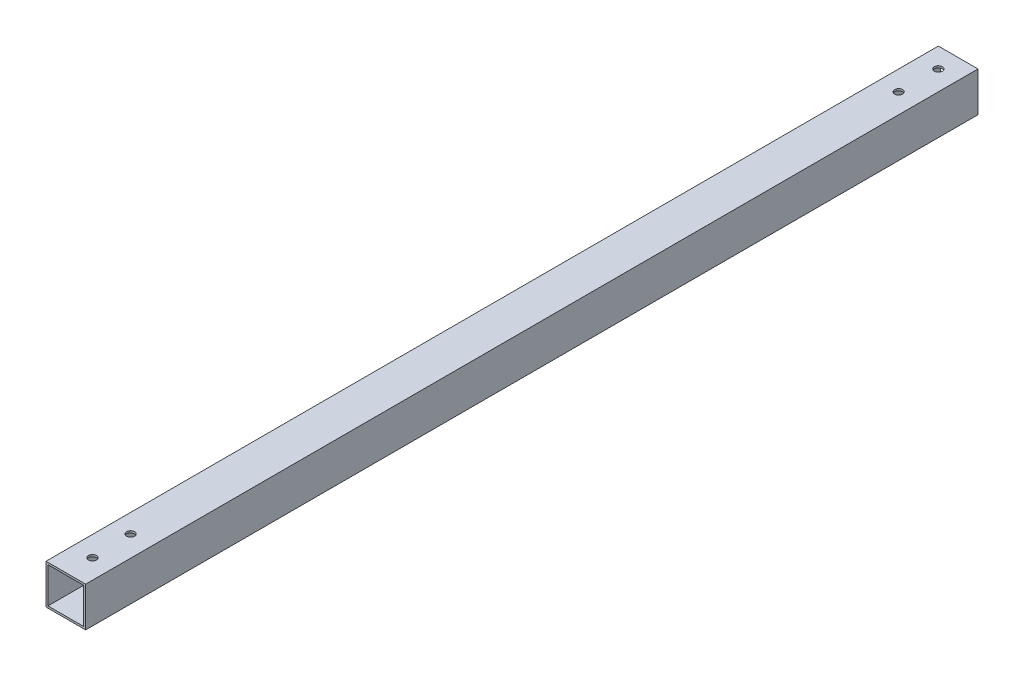
ISO-10303-21;
HEADER;
FILE_DESCRIPTION(('STEP AP214'),'2;1');
FILE_NAME('part.step','',(''),(''),'','','');
FILE_SCHEMA(('AUTOMOTIVE_DESIGN { 1 0 10303 214 1 1 1 1 }'));
ENDSEC;
DATA;
#1=APPLICATION_CONTEXT('core data for automotive mechanical design processes');
#2=APPLICATION_PROTOCOL_DEFINITION('international standard','automotive_design',2000,#1);
#3=PRODUCT_CONTEXT('',#1,'mechanical');
#4=PRODUCT('Part','Part','',(#3));
#5=PRODUCT_RELATED_PRODUCT_CATEGORY('part','',(#4));
#6=PRODUCT_DEFINITION_FORMATION('','',#4);
#7=PRODUCT_DEFINITION_CONTEXT('part definition',#1,'design');
#8=PRODUCT_DEFINITION('design','',#6,#7);
#9=PRODUCT_DEFINITION_SHAPE('','',#8);
#10=(LENGTH_UNIT() NAMED_UNIT(*) SI_UNIT(.MILLI.,.METRE.));
#11=(NAMED_UNIT(*) PLANE_ANGLE_UNIT() SI_UNIT($,.RADIAN.));
#12=(NAMED_UNIT(*) SI_UNIT($,.STERADIAN.) SOLID_ANGLE_UNIT());
#13=UNCERTAINTY_MEASURE_WITH_UNIT(LENGTH_MEASURE(1.E-05),#10,'distance_accuracy_value','');
#14=(GEOMETRIC_REPRESENTATION_CONTEXT(3) GLOBAL_UNCERTAINTY_ASSIGNED_CONTEXT((#13)) GLOBAL_UNIT_ASSIGNED_CONTEXT((#10,
#11,#12)) REPRESENTATION_CONTEXT('',''));
#15=CARTESIAN_POINT('',(0.,0.,0.));
#16=DIRECTION('',(0.,0.,1.));
#17=DIRECTION('',(1.,0.,0.));
#18=AXIS2_PLACEMENT_3D('',#15,#16,#17);
#19=CARTESIAN_POINT('',(0.,0.,450.));
#20=DIRECTION('',(0.,0.,-1.));
#21=DIRECTION('',(-1.,0.,0.));
#22=AXIS2_PLACEMENT_3D('',#19,#20,#21);
#23=PLANE('',#22);
#24=DIRECTION('',(0.,-1.,0.));
#25=VECTOR('',#24,1.);
#26=CARTESIAN_POINT('',(-10.,9.99999999999999,450.));
#27=LINE('',#26,#25);
#28=CARTESIAN_POINT('',(-10.,9.99999999999999,450.));
#29=VERTEX_POINT('',#28);
#30=CARTESIAN_POINT('',(-10.,-10.,450.));
#31=VERTEX_POINT('',#30);
#32=EDGE_CURVE('E148',#29,#31,#27,.T.);
#33=ORIENTED_EDGE('',*,*,#32,.T.);
#34=DIRECTION('',(1.,0.,0.));
#35=VECTOR('',#34,1.);
#36=CARTESIAN_POINT('',(10.,-10.,450.));
#37=LINE('',#36,#35);
#38=CARTESIAN_POINT('',(10.,-10.,450.));
#39=VERTEX_POINT('',#38);
#40=EDGE_CURVE('E151',#31,#39,#37,.T.);
#41=ORIENTED_EDGE('',*,*,#40,.T.);
#42=DIRECTION('',(0.,1.,0.));
#43=VECTOR('',#42,1.);
#44=CARTESIAN_POINT('',(9.99999999999999,10.,450.));
#45=LINE('',#44,#43);
#46=CARTESIAN_POINT('',(9.99999999999999,10.,450.));
#47=VERTEX_POINT('',#46);
#48=EDGE_CURVE('E154',#39,#47,#45,.T.);
#49=ORIENTED_EDGE('',*,*,#48,.T.);
#50=DIRECTION('',(-1.,0.,0.));
#51=VECTOR('',#50,1.);
#52=CARTESIAN_POINT('',(9.99999999999999,10.,450.));
#53=LINE('',#52,#51);
#54=EDGE_CURVE('E156',#47,#29,#53,.T.);
#55=ORIENTED_EDGE('',*,*,#54,.T.);
#56=EDGE_LOOP('',(#33,#41,#49,#55));
#57=FACE_BOUND('',#56,.T.);
#58=DIRECTION('',(0.,1.,0.));
#59=VECTOR('',#58,1.);
#60=CARTESIAN_POINT('',(9.,-9.,450.));
#61=LINE('',#60,#59);
#62=CARTESIAN_POINT('',(9.,-9.,450.));
#63=VERTEX_POINT('',#62);
#64=CARTESIAN_POINT('',(9.,9.,450.));
#65=VERTEX_POINT('',#64);
#66=EDGE_CURVE('E110',#63,#65,#61,.T.);
#67=ORIENTED_EDGE('',*,*,#66,.F.);
#68=DIRECTION('',(1.,0.,0.));
#69=VECTOR('',#68,1.);
#70=CARTESIAN_POINT('',(-9.,-9.,450.));
#71=LINE('',#70,#69);
#72=CARTESIAN_POINT('',(-9.,-9.,450.));
#73=VERTEX_POINT('',#72);
#74=EDGE_CURVE('E132',#73,#63,#71,.T.);
#75=ORIENTED_EDGE('',*,*,#74,.F.);
#76=DIRECTION('',(0.,-1.,0.));
#77=VECTOR('',#76,1.);
#78=CARTESIAN_POINT('',(-9.,-9.,450.));
#79=LINE('',#78,#77);
#80=CARTESIAN_POINT('',(-9.,9.,450.));
#81=VERTEX_POINT('',#80);
#82=EDGE_CURVE('E130',#81,#73,#79,.T.);
#83=ORIENTED_EDGE('',*,*,#82,.F.);
#84=DIRECTION('',(-1.,0.,0.));
#85=VECTOR('',#84,1.);
#86=CARTESIAN_POINT('',(-9.,9.,450.));
#87=LINE('',#86,#85);
#88=EDGE_CURVE('E118',#65,#81,#87,.T.);
#89=ORIENTED_EDGE('',*,*,#88,.F.);
#90=EDGE_LOOP('',(#67,#75,#83,#89));
#91=FACE_BOUND('',#90,.T.);
#92=ADVANCED_FACE('F43',(#57,#91),#23,.F.);
#93=CARTESIAN_POINT('',(0.,0.,0.));
#94=DIRECTION('',(0.,0.,-1.));
#95=DIRECTION('',(-1.,0.,0.));
#96=AXIS2_PLACEMENT_3D('',#93,#94,#95);
#97=PLANE('',#96);
#98=DIRECTION('',(0.,-1.,0.));
#99=VECTOR('',#98,1.);
#100=CARTESIAN_POINT('',(-10.,9.99999999999999,0.));
#101=LINE('',#100,#99);
#102=CARTESIAN_POINT('',(-10.,9.99999999999999,0.));
#103=VERTEX_POINT('',#102);
#104=CARTESIAN_POINT('',(-10.,-10.,0.));
#105=VERTEX_POINT('',#104);
#106=EDGE_CURVE('E126',#103,#105,#101,.T.);
#107=ORIENTED_EDGE('',*,*,#106,.F.);
#108=DIRECTION('',(-1.,0.,0.));
#109=VECTOR('',#108,1.);
#110=CARTESIAN_POINT('',(9.99999999999999,10.,0.));
#111=LINE('',#110,#109);
#112=CARTESIAN_POINT('',(9.99999999999999,10.,0.));
#113=VERTEX_POINT('',#112);
#114=EDGE_CURVE('E152',#113,#103,#111,.T.);
#115=ORIENTED_EDGE('',*,*,#114,.F.);
#116=DIRECTION('',(0.,1.,0.));
#117=VECTOR('',#116,1.);
#118=CARTESIAN_POINT('',(9.99999999999999,10.,0.));
#119=LINE('',#118,#117);
#120=CARTESIAN_POINT('',(10.,-10.,0.));
#121=VERTEX_POINT('',#120);
#122=EDGE_CURVE('E163',#121,#113,#119,.T.);
#123=ORIENTED_EDGE('',*,*,#122,.F.);
#124=DIRECTION('',(1.,0.,0.));
#125=VECTOR('',#124,1.);
#126=CARTESIAN_POINT('',(10.,-10.,0.));
#127=LINE('',#126,#125);
#128=EDGE_CURVE('E161',#105,#121,#127,.T.);
#129=ORIENTED_EDGE('',*,*,#128,.F.);
#130=EDGE_LOOP('',(#107,#115,#123,#129));
#131=FACE_BOUND('',#130,.T.);
#132=DIRECTION('',(1.,0.,0.));
#133=VECTOR('',#132,1.);
#134=CARTESIAN_POINT('',(-9.,-9.,0.));
#135=LINE('',#134,#133);
#136=CARTESIAN_POINT('',(-9.,-9.,0.));
#137=VERTEX_POINT('',#136);
#138=CARTESIAN_POINT('',(9.,-9.,0.));
#139=VERTEX_POINT('',#138);
#140=EDGE_CURVE('E119',#137,#139,#135,.T.);
#141=ORIENTED_EDGE('',*,*,#140,.T.);
#142=DIRECTION('',(0.,1.,0.));
#143=VECTOR('',#142,1.);
#144=CARTESIAN_POINT('',(9.,-9.,0.));
#145=LINE('',#144,#143);
#146=CARTESIAN_POINT('',(9.,9.,0.));
#147=VERTEX_POINT('',#146);
#148=EDGE_CURVE('E68',#139,#147,#145,.T.);
#149=ORIENTED_EDGE('',*,*,#148,.T.);
#150=DIRECTION('',(-1.,0.,0.));
#151=VECTOR('',#150,1.);
#152=CARTESIAN_POINT('',(-9.,9.,0.));
#153=LINE('',#152,#151);
#154=CARTESIAN_POINT('',(-9.,9.,0.));
#155=VERTEX_POINT('',#154);
#156=EDGE_CURVE('E125',#147,#155,#153,.T.);
#157=ORIENTED_EDGE('',*,*,#156,.T.);
#158=DIRECTION('',(0.,-1.,0.));
#159=VECTOR('',#158,1.);
#160=CARTESIAN_POINT('',(-9.,-9.,0.));
#161=LINE('',#160,#159);
#162=EDGE_CURVE('E140',#155,#137,#161,.T.);
#163=ORIENTED_EDGE('',*,*,#162,.T.);
#164=EDGE_LOOP('',(#141,#149,#157,#163));
#165=FACE_BOUND('',#164,.T.);
#166=ADVANCED_FACE('F243',(#131,#165),#97,.T.);
#167=CARTESIAN_POINT('',(-10.,9.99999999999999,450.));
#168=DIRECTION('',(1.,0.,0.));
#169=DIRECTION('',(0.,1.,0.));
#170=AXIS2_PLACEMENT_3D('',#167,#168,#169);
#171=PLANE('',#170);
#172=ORIENTED_EDGE('',*,*,#106,.T.);
#173=DIRECTION('',(0.,0.,-1.));
#174=VECTOR('',#173,1.);
#175=CARTESIAN_POINT('',(-10.,-10.,450.));
#176=LINE('',#175,#174);
#177=EDGE_CURVE('E11',#31,#105,#176,.T.);
#178=ORIENTED_EDGE('',*,*,#177,.F.);
#179=ORIENTED_EDGE('',*,*,#32,.F.);
#180=DIRECTION('',(0.,0.,-1.));
#181=VECTOR('',#180,1.);
#182=CARTESIAN_POINT('',(-10.,9.99999999999999,450.));
#183=LINE('',#182,#181);
#184=EDGE_CURVE('E158',#29,#103,#183,.T.);
#185=ORIENTED_EDGE('',*,*,#184,.T.);
#186=EDGE_LOOP('',(#172,#178,#179,#185));
#187=FACE_BOUND('',#186,.T.);
#188=ADVANCED_FACE('F45',(#187),#171,.F.);
#189=CARTESIAN_POINT('',(10.,-10.,450.));
#190=DIRECTION('',(0.,1.,0.));
#191=DIRECTION('',(-1.,0.,0.));
#192=AXIS2_PLACEMENT_3D('',#189,#190,#191);
#193=PLANE('',#192);
#194=CARTESIAN_POINT('',(0.200882019528975,-10.,436.720938127855));
#195=DIRECTION('',(0.,1.,0.));
#196=DIRECTION('',(-1.,0.,0.));
#197=AXIS2_PLACEMENT_3D('',#194,#195,#196);
#198=CIRCLE('',#197,2.);
#199=CARTESIAN_POINT('',(-1.79911798047103,-10.,436.720938127855));
#200=VERTEX_POINT('',#199);
#201=EDGE_CURVE('E204',#200,#200,#198,.T.);
#202=ORIENTED_EDGE('',*,*,#201,.T.);
#203=EDGE_LOOP('',(#202));
#204=FACE_BOUND('',#203,.T.);
#205=CARTESIAN_POINT('',(-0.572874553480826,-10.,416.735911213544));
#206=DIRECTION('',(0.,1.,0.));
#207=DIRECTION('',(-1.,0.,0.));
#208=AXIS2_PLACEMENT_3D('',#205,#206,#207);
#209=CIRCLE('',#208,2.);
#210=CARTESIAN_POINT('',(-2.57287455348083,-10.,416.735911213544));
#211=VERTEX_POINT('',#210);
#212=EDGE_CURVE('E189',#211,#211,#209,.T.);
#213=ORIENTED_EDGE('',*,*,#212,.T.);
#214=EDGE_LOOP('',(#213));
#215=FACE_BOUND('',#214,.T.);
#216=CARTESIAN_POINT('',(0.,-10.,10.));
#217=DIRECTION('',(0.,1.,0.));
#218=DIRECTION('',(-1.,0.,0.));
#219=AXIS2_PLACEMENT_3D('',#216,#217,#218);
#220=CIRCLE('',#219,2.);
#221=CARTESIAN_POINT('',(-2.,-10.,10.));
#222=VERTEX_POINT('',#221);
#223=EDGE_CURVE('E138',#222,#222,#220,.T.);
#224=ORIENTED_EDGE('',*,*,#223,.T.);
#225=EDGE_LOOP('',(#224));
#226=FACE_BOUND('',#225,.T.);
#227=CARTESIAN_POINT('',(0.,-10.,30.));
#228=DIRECTION('',(0.,1.,0.));
#229=DIRECTION('',(-1.,0.,0.));
#230=AXIS2_PLACEMENT_3D('',#227,#228,#229);
#231=CIRCLE('',#230,2.);
#232=CARTESIAN_POINT('',(-2.,-10.,30.));
#233=VERTEX_POINT('',#232);
#234=EDGE_CURVE('E181',#233,#233,#231,.T.);
#235=ORIENTED_EDGE('',*,*,#234,.T.);
#236=EDGE_LOOP('',(#235));
#237=FACE_BOUND('',#236,.T.);
#238=ORIENTED_EDGE('',*,*,#128,.T.);
#239=DIRECTION('',(0.,0.,-1.));
#240=VECTOR('',#239,1.);
#241=CARTESIAN_POINT('',(10.,-10.,450.));
#242=LINE('',#241,#240);
#243=EDGE_CURVE('E52',#39,#121,#242,.T.);
#244=ORIENTED_EDGE('',*,*,#243,.F.);
#245=ORIENTED_EDGE('',*,*,#40,.F.);
#246=ORIENTED_EDGE('',*,*,#177,.T.);
#247=EDGE_LOOP('',(#238,#244,#245,#246));
#248=FACE_BOUND('',#247,.T.);
#249=ADVANCED_FACE('F220',(#204,#215,#226,#237,#248),#193,.F.);
#250=CARTESIAN_POINT('',(9.99999999999999,10.,450.));
#251=DIRECTION('',(-1.,0.,0.));
#252=DIRECTION('',(0.,-1.,0.));
#253=AXIS2_PLACEMENT_3D('',#250,#251,#252);
#254=PLANE('',#253);
#255=ORIENTED_EDGE('',*,*,#122,.T.);
#256=DIRECTION('',(0.,0.,-1.));
#257=VECTOR('',#256,1.);
#258=CARTESIAN_POINT('',(9.99999999999999,10.,450.));
#259=LINE('',#258,#257);
#260=EDGE_CURVE('E168',#47,#113,#259,.T.);
#261=ORIENTED_EDGE('',*,*,#260,.F.);
#262=ORIENTED_EDGE('',*,*,#48,.F.);
#263=ORIENTED_EDGE('',*,*,#243,.T.);
#264=EDGE_LOOP('',(#255,#261,#262,#263));
#265=FACE_BOUND('',#264,.T.);
#266=ADVANCED_FACE('F257',(#265),#254,.F.);
#267=CARTESIAN_POINT('',(9.99999999999999,10.,450.));
#268=DIRECTION('',(0.,-1.,0.));
#269=DIRECTION('',(1.,0.,0.));
#270=AXIS2_PLACEMENT_3D('',#267,#268,#269);
#271=PLANE('',#270);
#272=CARTESIAN_POINT('',(0.200882019528972,10.,436.720938127855));
#273=DIRECTION('',(0.,1.,0.));
#274=DIRECTION('',(-1.,0.,0.));
#275=AXIS2_PLACEMENT_3D('',#272,#273,#274);
#276=CIRCLE('',#275,2.);
#277=CARTESIAN_POINT('',(-1.79911798047103,10.,436.720938127855));
#278=VERTEX_POINT('',#277);
#279=EDGE_CURVE('E185',#278,#278,#276,.T.);
#280=ORIENTED_EDGE('',*,*,#279,.F.);
#281=EDGE_LOOP('',(#280));
#282=FACE_BOUND('',#281,.T.);
#283=CARTESIAN_POINT('',(-0.57287455348083,10.,416.735911213544));
#284=DIRECTION('',(0.,1.,0.));
#285=DIRECTION('',(-1.,0.,0.));
#286=AXIS2_PLACEMENT_3D('',#283,#284,#285);
#287=CIRCLE('',#286,2.);
#288=CARTESIAN_POINT('',(-2.57287455348083,10.,416.735911213544));
#289=VERTEX_POINT('',#288);
#290=EDGE_CURVE('E192',#289,#289,#287,.T.);
#291=ORIENTED_EDGE('',*,*,#290,.F.);
#292=EDGE_LOOP('',(#291));
#293=FACE_BOUND('',#292,.T.);
#294=CARTESIAN_POINT('',(0.,10.,10.));
#295=DIRECTION('',(0.,1.,0.));
#296=DIRECTION('',(-1.,0.,0.));
#297=AXIS2_PLACEMENT_3D('',#294,#295,#296);
#298=CIRCLE('',#297,2.);
#299=CARTESIAN_POINT('',(-2.,10.,10.));
#300=VERTEX_POINT('',#299);
#301=EDGE_CURVE('E177',#300,#300,#298,.T.);
#302=ORIENTED_EDGE('',*,*,#301,.F.);
#303=EDGE_LOOP('',(#302));
#304=FACE_BOUND('',#303,.T.);
#305=CARTESIAN_POINT('',(0.,10.,30.));
#306=DIRECTION('',(0.,1.,0.));
#307=DIRECTION('',(-1.,0.,0.));
#308=AXIS2_PLACEMENT_3D('',#305,#306,#307);
#309=CIRCLE('',#308,2.);
#310=CARTESIAN_POINT('',(-2.,10.,30.));
#311=VERTEX_POINT('',#310);
#312=EDGE_CURVE('E207',#311,#311,#309,.T.);
#313=ORIENTED_EDGE('',*,*,#312,.F.);
#314=EDGE_LOOP('',(#313));
#315=FACE_BOUND('',#314,.T.);
#316=ORIENTED_EDGE('',*,*,#114,.T.);
#317=ORIENTED_EDGE('',*,*,#184,.F.);
#318=ORIENTED_EDGE('',*,*,#54,.F.);
#319=ORIENTED_EDGE('',*,*,#260,.T.);
#320=EDGE_LOOP('',(#316,#317,#318,#319));
#321=FACE_BOUND('',#320,.T.);
#322=ADVANCED_FACE('F254',(#282,#293,#304,#315,#321),#271,.F.);
#323=CARTESIAN_POINT('',(9.,-9.,450.));
#324=DIRECTION('',(-1.,0.,0.));
#325=DIRECTION('',(0.,-1.,0.));
#326=AXIS2_PLACEMENT_3D('',#323,#324,#325);
#327=PLANE('',#326);
#328=ORIENTED_EDGE('',*,*,#148,.F.);
#329=DIRECTION('',(0.,0.,-1.));
#330=VECTOR('',#329,1.);
#331=CARTESIAN_POINT('',(9.,-9.,450.));
#332=LINE('',#331,#330);
#333=EDGE_CURVE('E114',#63,#139,#332,.T.);
#334=ORIENTED_EDGE('',*,*,#333,.F.);
#335=ORIENTED_EDGE('',*,*,#66,.T.);
#336=DIRECTION('',(0.,0.,-1.));
#337=VECTOR('',#336,1.);
#338=CARTESIAN_POINT('',(9.,9.,450.));
#339=LINE('',#338,#337);
#340=EDGE_CURVE('E113',#65,#147,#339,.T.);
#341=ORIENTED_EDGE('',*,*,#340,.T.);
#342=EDGE_LOOP('',(#328,#334,#335,#341));
#343=FACE_BOUND('',#342,.T.);
#344=ADVANCED_FACE('F112',(#343),#327,.T.);
#345=CARTESIAN_POINT('',(-9.,9.,450.));
#346=DIRECTION('',(0.,-1.,0.));
#347=DIRECTION('',(1.,0.,0.));
#348=AXIS2_PLACEMENT_3D('',#345,#346,#347);
#349=PLANE('',#348);
#350=CARTESIAN_POINT('',(0.200882019528972,9.00000000000001,436.720938127855));
#351=DIRECTION('',(0.,-1.,0.));
#352=DIRECTION('',(1.,0.,0.));
#353=AXIS2_PLACEMENT_3D('',#350,#351,#352);
#354=CIRCLE('',#353,2.);
#355=CARTESIAN_POINT('',(2.20088201952897,9.00000000000001,436.720938127855));
#356=VERTEX_POINT('',#355);
#357=EDGE_CURVE('E201',#356,#356,#354,.T.);
#358=ORIENTED_EDGE('',*,*,#357,.F.);
#359=EDGE_LOOP('',(#358));
#360=FACE_BOUND('',#359,.T.);
#361=CARTESIAN_POINT('',(-0.57287455348083,9.00000000000001,416.735911213544));
#362=DIRECTION('',(0.,-1.,0.));
#363=DIRECTION('',(1.,0.,0.));
#364=AXIS2_PLACEMENT_3D('',#361,#362,#363);
#365=CIRCLE('',#364,2.);
#366=CARTESIAN_POINT('',(1.42712544651917,9.00000000000001,416.735911213544));
#367=VERTEX_POINT('',#366);
#368=EDGE_CURVE('E184',#367,#367,#365,.T.);
#369=ORIENTED_EDGE('',*,*,#368,.F.);
#370=EDGE_LOOP('',(#369));
#371=FACE_BOUND('',#370,.T.);
#372=CARTESIAN_POINT('',(0.,9.00000000000001,10.));
#373=DIRECTION('',(0.,-1.,0.));
#374=DIRECTION('',(1.,0.,0.));
#375=AXIS2_PLACEMENT_3D('',#372,#373,#374);
#376=CIRCLE('',#375,2.);
#377=CARTESIAN_POINT('',(2.,9.00000000000001,10.));
#378=VERTEX_POINT('',#377);
#379=EDGE_CURVE('E180',#378,#378,#376,.T.);
#380=ORIENTED_EDGE('',*,*,#379,.F.);
#381=EDGE_LOOP('',(#380));
#382=FACE_BOUND('',#381,.T.);
#383=CARTESIAN_POINT('',(0.,9.00000000000001,30.));
#384=DIRECTION('',(0.,-1.,0.));
#385=DIRECTION('',(1.,0.,0.));
#386=AXIS2_PLACEMENT_3D('',#383,#384,#385);
#387=CIRCLE('',#386,2.);
#388=CARTESIAN_POINT('',(2.,9.00000000000001,30.));
#389=VERTEX_POINT('',#388);
#390=EDGE_CURVE('E176',#389,#389,#387,.T.);
#391=ORIENTED_EDGE('',*,*,#390,.F.);
#392=EDGE_LOOP('',(#391));
#393=FACE_BOUND('',#392,.T.);
#394=ORIENTED_EDGE('',*,*,#156,.F.);
#395=ORIENTED_EDGE('',*,*,#340,.F.);
#396=ORIENTED_EDGE('',*,*,#88,.T.);
#397=DIRECTION('',(0.,0.,-1.));
#398=VECTOR('',#397,1.);
#399=CARTESIAN_POINT('',(-9.,9.,450.));
#400=LINE('',#399,#398);
#401=EDGE_CURVE('E127',#81,#155,#400,.T.);
#402=ORIENTED_EDGE('',*,*,#401,.T.);
#403=EDGE_LOOP('',(#394,#395,#396,#402));
#404=FACE_BOUND('',#403,.T.);
#405=ADVANCED_FACE('F122',(#360,#371,#382,#393,#404),#349,.T.);
#406=CARTESIAN_POINT('',(-9.,-9.,450.));
#407=DIRECTION('',(1.,0.,0.));
#408=DIRECTION('',(0.,1.,0.));
#409=AXIS2_PLACEMENT_3D('',#406,#407,#408);
#410=PLANE('',#409);
#411=ORIENTED_EDGE('',*,*,#162,.F.);
#412=ORIENTED_EDGE('',*,*,#401,.F.);
#413=ORIENTED_EDGE('',*,*,#82,.T.);
#414=DIRECTION('',(0.,0.,-1.));
#415=VECTOR('',#414,1.);
#416=CARTESIAN_POINT('',(-9.,-9.,450.));
#417=LINE('',#416,#415);
#418=EDGE_CURVE('E60',#73,#137,#417,.T.);
#419=ORIENTED_EDGE('',*,*,#418,.T.);
#420=EDGE_LOOP('',(#411,#412,#413,#419));
#421=FACE_BOUND('',#420,.T.);
#422=ADVANCED_FACE('F309',(#421),#410,.T.);
#423=CARTESIAN_POINT('',(-9.,-9.,450.));
#424=DIRECTION('',(0.,1.,0.));
#425=DIRECTION('',(0.,0.,1.));
#426=AXIS2_PLACEMENT_3D('',#423,#424,#425);
#427=PLANE('',#426);
#428=CARTESIAN_POINT('',(0.200882019528975,-9.00000000000001,436.720938127855));
#429=DIRECTION('',(0.,1.,0.));
#430=DIRECTION('',(0.,0.,1.));
#431=AXIS2_PLACEMENT_3D('',#428,#429,#430);
#432=CIRCLE('',#431,2.);
#433=CARTESIAN_POINT('',(0.200882019528975,-9.00000000000001,438.720938127855));
#434=VERTEX_POINT('',#433);
#435=EDGE_CURVE('E47',#434,#434,#432,.T.);
#436=ORIENTED_EDGE('',*,*,#435,.F.);
#437=EDGE_LOOP('',(#436));
#438=FACE_BOUND('',#437,.T.);
#439=CARTESIAN_POINT('',(-0.572874553480827,-9.00000000000001,416.735911213544));
#440=DIRECTION('',(0.,1.,0.));
#441=DIRECTION('',(0.,0.,1.));
#442=AXIS2_PLACEMENT_3D('',#439,#440,#441);
#443=CIRCLE('',#442,2.);
#444=CARTESIAN_POINT('',(-0.572874553480827,-9.00000000000001,418.735911213544));
#445=VERTEX_POINT('',#444);
#446=EDGE_CURVE('E182',#445,#445,#443,.T.);
#447=ORIENTED_EDGE('',*,*,#446,.F.);
#448=EDGE_LOOP('',(#447));
#449=FACE_BOUND('',#448,.T.);
#450=CARTESIAN_POINT('',(0.,-9.00000000000001,10.));
#451=DIRECTION('',(0.,1.,0.));
#452=DIRECTION('',(0.,0.,1.));
#453=AXIS2_PLACEMENT_3D('',#450,#451,#452);
#454=CIRCLE('',#453,2.);
#455=CARTESIAN_POINT('',(0.,-9.00000000000001,12.));
#456=VERTEX_POINT('',#455);
#457=EDGE_CURVE('E178',#456,#456,#454,.T.);
#458=ORIENTED_EDGE('',*,*,#457,.F.);
#459=EDGE_LOOP('',(#458));
#460=FACE_BOUND('',#459,.T.);
#461=CARTESIAN_POINT('',(0.,-9.00000000000001,30.));
#462=DIRECTION('',(0.,1.,0.));
#463=DIRECTION('',(0.,0.,1.));
#464=AXIS2_PLACEMENT_3D('',#461,#462,#463);
#465=CIRCLE('',#464,2.);
#466=CARTESIAN_POINT('',(0.,-9.00000000000001,32.));
#467=VERTEX_POINT('',#466);
#468=EDGE_CURVE('E173',#467,#467,#465,.T.);
#469=ORIENTED_EDGE('',*,*,#468,.F.);
#470=EDGE_LOOP('',(#469));
#471=FACE_BOUND('',#470,.T.);
#472=ORIENTED_EDGE('',*,*,#140,.F.);
#473=ORIENTED_EDGE('',*,*,#418,.F.);
#474=ORIENTED_EDGE('',*,*,#74,.T.);
#475=ORIENTED_EDGE('',*,*,#333,.T.);
#476=EDGE_LOOP('',(#472,#473,#474,#475));
#477=FACE_BOUND('',#476,.T.);
#478=ADVANCED_FACE('F236',(#438,#449,#460,#471,#477),#427,.T.);
#479=CARTESIAN_POINT('',(0.,-420.,30.));
#480=DIRECTION('',(0.,1.,0.));
#481=DIRECTION('',(-1.,0.,0.));
#482=AXIS2_PLACEMENT_3D('',#479,#480,#481);
#483=CYLINDRICAL_SURFACE('',#482,2.);
#484=ORIENTED_EDGE('',*,*,#468,.T.);
#485=EDGE_LOOP('',(#484));
#486=FACE_BOUND('',#485,.T.);
#487=ORIENTED_EDGE('',*,*,#234,.F.);
#488=EDGE_LOOP('',(#487));
#489=FACE_BOUND('',#488,.T.);
#490=ADVANCED_FACE('F226',(#486,#489),#483,.F.);
#491=CARTESIAN_POINT('',(0.,-420.,10.));
#492=DIRECTION('',(0.,1.,0.));
#493=DIRECTION('',(-1.,0.,0.));
#494=AXIS2_PLACEMENT_3D('',#491,#492,#493);
#495=CYLINDRICAL_SURFACE('',#494,2.);
#496=ORIENTED_EDGE('',*,*,#457,.T.);
#497=EDGE_LOOP('',(#496));
#498=FACE_BOUND('',#497,.T.);
#499=ORIENTED_EDGE('',*,*,#223,.F.);
#500=EDGE_LOOP('',(#499));
#501=FACE_BOUND('',#500,.T.);
#502=ADVANCED_FACE('F223',(#498,#501),#495,.F.);
#503=ORIENTED_EDGE('',*,*,#390,.T.);
#504=EDGE_LOOP('',(#503));
#505=FACE_BOUND('',#504,.T.);
#506=ORIENTED_EDGE('',*,*,#312,.T.);
#507=EDGE_LOOP('',(#506));
#508=FACE_BOUND('',#507,.T.);
#509=ADVANCED_FACE('F225',(#505,#508),#483,.F.);
#510=ORIENTED_EDGE('',*,*,#379,.T.);
#511=EDGE_LOOP('',(#510));
#512=FACE_BOUND('',#511,.T.);
#513=ORIENTED_EDGE('',*,*,#301,.T.);
#514=EDGE_LOOP('',(#513));
#515=FACE_BOUND('',#514,.T.);
#516=ADVANCED_FACE('F229',(#512,#515),#495,.F.);
#517=CARTESIAN_POINT('',(-0.572874553480755,-420.,416.735911213544));
#518=DIRECTION('',(0.,1.,0.));
#519=DIRECTION('',(-1.,0.,0.));
#520=AXIS2_PLACEMENT_3D('',#517,#518,#519);
#521=CYLINDRICAL_SURFACE('',#520,2.);
#522=ORIENTED_EDGE('',*,*,#446,.T.);
#523=EDGE_LOOP('',(#522));
#524=FACE_BOUND('',#523,.T.);
#525=ORIENTED_EDGE('',*,*,#212,.F.);
#526=EDGE_LOOP('',(#525));
#527=FACE_BOUND('',#526,.T.);
#528=ADVANCED_FACE('F240',(#524,#527),#521,.F.);
#529=CARTESIAN_POINT('',(0.200882019529046,-420.,436.720938127855));
#530=DIRECTION('',(0.,1.,0.));
#531=DIRECTION('',(-1.,0.,0.));
#532=AXIS2_PLACEMENT_3D('',#529,#530,#531);
#533=CYLINDRICAL_SURFACE('',#532,2.);
#534=ORIENTED_EDGE('',*,*,#435,.T.);
#535=EDGE_LOOP('',(#534));
#536=FACE_BOUND('',#535,.T.);
#537=ORIENTED_EDGE('',*,*,#201,.F.);
#538=EDGE_LOOP('',(#537));
#539=FACE_BOUND('',#538,.T.);
#540=ADVANCED_FACE('F272',(#536,#539),#533,.F.);
#541=ORIENTED_EDGE('',*,*,#368,.T.);
#542=EDGE_LOOP('',(#541));
#543=FACE_BOUND('',#542,.T.);
#544=ORIENTED_EDGE('',*,*,#290,.T.);
#545=EDGE_LOOP('',(#544));
#546=FACE_BOUND('',#545,.T.);
#547=ADVANCED_FACE('F273',(#543,#546),#521,.F.);
#548=ORIENTED_EDGE('',*,*,#357,.T.);
#549=EDGE_LOOP('',(#548));
#550=FACE_BOUND('',#549,.T.);
#551=ORIENTED_EDGE('',*,*,#279,.T.);
#552=EDGE_LOOP('',(#551));
#553=FACE_BOUND('',#552,.T.);
#554=ADVANCED_FACE('F279',(#550,#553),#533,.F.);
#555=CLOSED_SHELL('',(#92,#166,#188,#249,#266,#322,#344,#405,#422,#478,#490,#502,#509,#516,#528,
#540,#547,#554));
#556=MANIFOLD_SOLID_BREP('B2',#555);
#557=ADVANCED_BREP_SHAPE_REPRESENTATION('',(#18,#556),#14);
#558=SHAPE_DEFINITION_REPRESENTATION(#9,#557);
ENDSEC;
END-ISO-10303-21;
